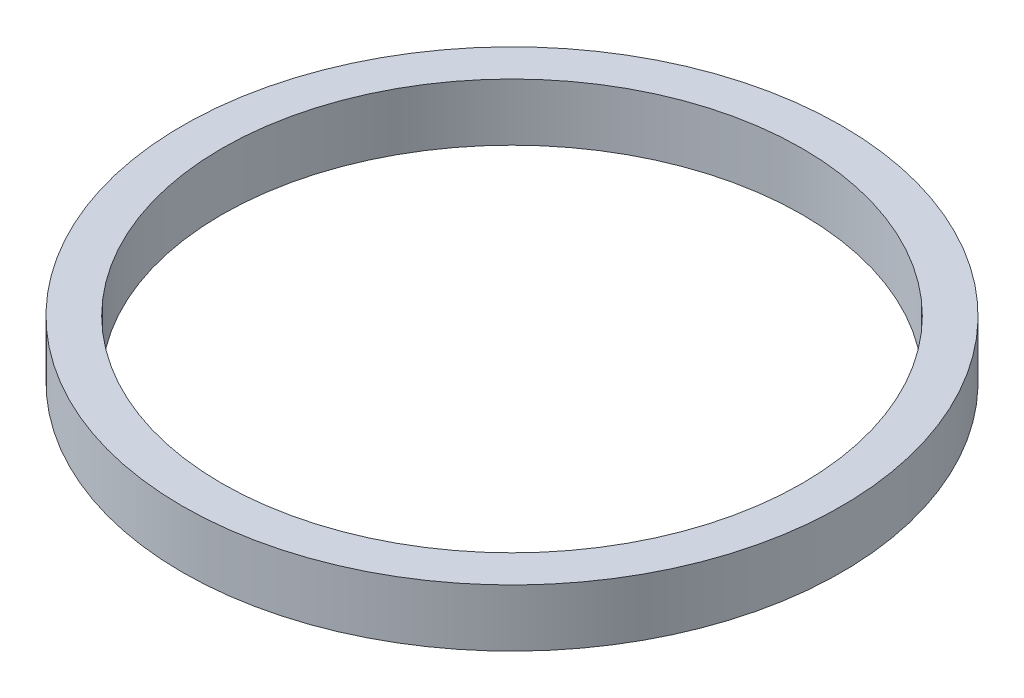
ISO-10303-21;
HEADER;
FILE_DESCRIPTION(('STEP AP214'),'2;1');
FILE_NAME('part.step','',(''),(''),'','','');
FILE_SCHEMA(('AUTOMOTIVE_DESIGN { 1 0 10303 214 1 1 1 1 }'));
ENDSEC;
DATA;
#1=APPLICATION_CONTEXT('core data for automotive mechanical design processes');
#2=APPLICATION_PROTOCOL_DEFINITION('international standard','automotive_design',2000,#1);
#3=PRODUCT_CONTEXT('',#1,'mechanical');
#4=PRODUCT('Part','Part','',(#3));
#5=PRODUCT_RELATED_PRODUCT_CATEGORY('part','',(#4));
#6=PRODUCT_DEFINITION_FORMATION('','',#4);
#7=PRODUCT_DEFINITION_CONTEXT('part definition',#1,'design');
#8=PRODUCT_DEFINITION('design','',#6,#7);
#9=PRODUCT_DEFINITION_SHAPE('','',#8);
#10=(LENGTH_UNIT() NAMED_UNIT(*) SI_UNIT(.MILLI.,.METRE.));
#11=(NAMED_UNIT(*) PLANE_ANGLE_UNIT() SI_UNIT($,.RADIAN.));
#12=(NAMED_UNIT(*) SI_UNIT($,.STERADIAN.) SOLID_ANGLE_UNIT());
#13=UNCERTAINTY_MEASURE_WITH_UNIT(LENGTH_MEASURE(1.E-05),#10,'distance_accuracy_value','');
#14=(GEOMETRIC_REPRESENTATION_CONTEXT(3) GLOBAL_UNCERTAINTY_ASSIGNED_CONTEXT((#13)) GLOBAL_UNIT_ASSIGNED_CONTEXT((#10,
#11,#12)) REPRESENTATION_CONTEXT('',''));
#15=CARTESIAN_POINT('',(0.,0.,0.));
#16=DIRECTION('',(0.,0.,1.));
#17=DIRECTION('',(1.,0.,0.));
#18=AXIS2_PLACEMENT_3D('',#15,#16,#17);
#19=CARTESIAN_POINT('',(0.,4.,0.));
#20=DIRECTION('',(0.,1.,0.));
#21=DIRECTION('',(0.,0.,1.));
#22=AXIS2_PLACEMENT_3D('',#19,#20,#21);
#23=PLANE('',#22);
#24=CARTESIAN_POINT('',(0.,4.,0.));
#25=DIRECTION('',(0.,1.,0.));
#26=DIRECTION('',(0.,0.,1.));
#27=AXIS2_PLACEMENT_3D('',#24,#25,#26);
#28=CIRCLE('',#27,23.);
#29=CARTESIAN_POINT('',(0.,4.,23.));
#30=VERTEX_POINT('',#29);
#31=EDGE_CURVE('E10',#30,#30,#28,.T.);
#32=ORIENTED_EDGE('',*,*,#31,.T.);
#33=EDGE_LOOP('',(#32));
#34=FACE_BOUND('',#33,.T.);
#35=CARTESIAN_POINT('',(0.,4.,0.));
#36=DIRECTION('',(0.,1.,0.));
#37=DIRECTION('',(0.,0.,1.));
#38=AXIS2_PLACEMENT_3D('',#35,#36,#37);
#39=CIRCLE('',#38,20.25);
#40=CARTESIAN_POINT('',(0.,4.,20.25));
#41=VERTEX_POINT('',#40);
#42=EDGE_CURVE('E50',#41,#41,#39,.T.);
#43=ORIENTED_EDGE('',*,*,#42,.F.);
#44=EDGE_LOOP('',(#43));
#45=FACE_BOUND('',#44,.T.);
#46=ADVANCED_FACE('F37',(#34,#45),#23,.T.);
#47=CARTESIAN_POINT('',(0.,0.,0.));
#48=DIRECTION('',(0.,1.,0.));
#49=DIRECTION('',(0.,0.,1.));
#50=AXIS2_PLACEMENT_3D('',#47,#48,#49);
#51=PLANE('',#50);
#52=CARTESIAN_POINT('',(0.,0.,0.));
#53=DIRECTION('',(0.,1.,0.));
#54=DIRECTION('',(0.,0.,1.));
#55=AXIS2_PLACEMENT_3D('',#52,#53,#54);
#56=CIRCLE('',#55,23.);
#57=CARTESIAN_POINT('',(0.,0.,23.));
#58=VERTEX_POINT('',#57);
#59=EDGE_CURVE('E41',#58,#58,#56,.T.);
#60=ORIENTED_EDGE('',*,*,#59,.F.);
#61=EDGE_LOOP('',(#60));
#62=FACE_BOUND('',#61,.T.);
#63=CARTESIAN_POINT('',(0.,0.,0.));
#64=DIRECTION('',(0.,1.,0.));
#65=DIRECTION('',(0.,0.,1.));
#66=AXIS2_PLACEMENT_3D('',#63,#64,#65);
#67=CIRCLE('',#66,20.25);
#68=CARTESIAN_POINT('',(0.,0.,20.25));
#69=VERTEX_POINT('',#68);
#70=EDGE_CURVE('E52',#69,#69,#67,.T.);
#71=ORIENTED_EDGE('',*,*,#70,.T.);
#72=EDGE_LOOP('',(#71));
#73=FACE_BOUND('',#72,.T.);
#74=ADVANCED_FACE('F64',(#62,#73),#51,.F.);
#75=CARTESIAN_POINT('',(0.,4.,0.));
#76=DIRECTION('',(0.,-1.,0.));
#77=DIRECTION('',(0.,0.,-1.));
#78=AXIS2_PLACEMENT_3D('',#75,#76,#77);
#79=CYLINDRICAL_SURFACE('',#78,23.);
#80=ORIENTED_EDGE('',*,*,#31,.F.);
#81=EDGE_LOOP('',(#80));
#82=FACE_BOUND('',#81,.T.);
#83=ORIENTED_EDGE('',*,*,#59,.T.);
#84=EDGE_LOOP('',(#83));
#85=FACE_BOUND('',#84,.T.);
#86=ADVANCED_FACE('F39',(#82,#85),#79,.T.);
#87=CARTESIAN_POINT('',(0.,4.,0.));
#88=DIRECTION('',(0.,-1.,0.));
#89=DIRECTION('',(0.,0.,-1.));
#90=AXIS2_PLACEMENT_3D('',#87,#88,#89);
#91=CYLINDRICAL_SURFACE('',#90,20.25);
#92=ORIENTED_EDGE('',*,*,#42,.T.);
#93=EDGE_LOOP('',(#92));
#94=FACE_BOUND('',#93,.T.);
#95=ORIENTED_EDGE('',*,*,#70,.F.);
#96=EDGE_LOOP('',(#95));
#97=FACE_BOUND('',#96,.T.);
#98=ADVANCED_FACE('F60',(#94,#97),#91,.F.);
#99=CLOSED_SHELL('',(#46,#74,#86,#98));
#100=MANIFOLD_SOLID_BREP('B2',#99);
#101=ADVANCED_BREP_SHAPE_REPRESENTATION('',(#18,#100),#14);
#102=SHAPE_DEFINITION_REPRESENTATION(#9,#101);
ENDSEC;
END-ISO-10303-21;
